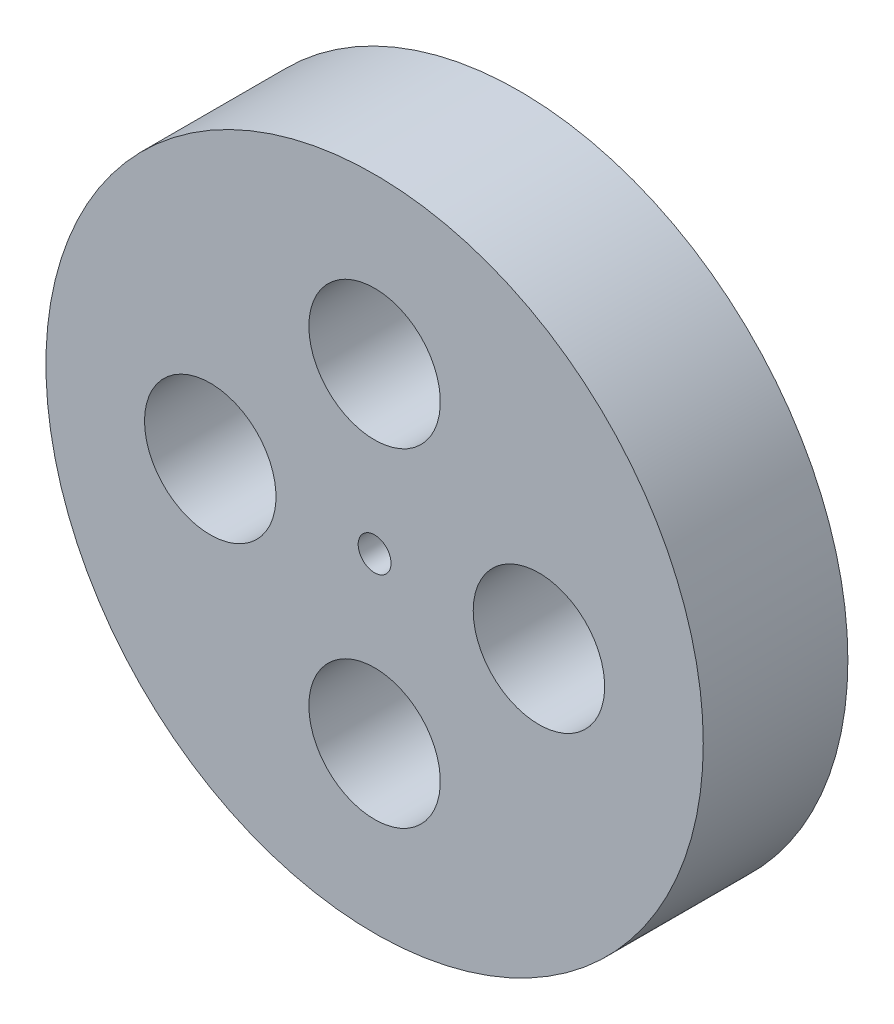
ISO-10303-21;
HEADER;
FILE_DESCRIPTION(('STEP AP214'),'2;1');
FILE_NAME('part.step','',(''),(''),'','','');
FILE_SCHEMA(('AUTOMOTIVE_DESIGN { 1 0 10303 214 1 1 1 1 }'));
ENDSEC;
DATA;
#1=APPLICATION_CONTEXT('core data for automotive mechanical design processes');
#2=APPLICATION_PROTOCOL_DEFINITION('international standard','automotive_design',2000,#1);
#3=PRODUCT_CONTEXT('',#1,'mechanical');
#4=PRODUCT('Part','Part','',(#3));
#5=PRODUCT_RELATED_PRODUCT_CATEGORY('part','',(#4));
#6=PRODUCT_DEFINITION_FORMATION('','',#4);
#7=PRODUCT_DEFINITION_CONTEXT('part definition',#1,'design');
#8=PRODUCT_DEFINITION('design','',#6,#7);
#9=PRODUCT_DEFINITION_SHAPE('','',#8);
#10=(LENGTH_UNIT() NAMED_UNIT(*) SI_UNIT(.MILLI.,.METRE.));
#11=(NAMED_UNIT(*) PLANE_ANGLE_UNIT() SI_UNIT($,.RADIAN.));
#12=(NAMED_UNIT(*) SI_UNIT($,.STERADIAN.) SOLID_ANGLE_UNIT());
#13=UNCERTAINTY_MEASURE_WITH_UNIT(LENGTH_MEASURE(1.E-05),#10,'distance_accuracy_value','');
#14=(GEOMETRIC_REPRESENTATION_CONTEXT(3) GLOBAL_UNCERTAINTY_ASSIGNED_CONTEXT((#13)) GLOBAL_UNIT_ASSIGNED_CONTEXT((#10,
#11,#12)) REPRESENTATION_CONTEXT('',''));
#15=CARTESIAN_POINT('',(0.,0.,0.));
#16=DIRECTION('',(0.,0.,1.));
#17=DIRECTION('',(1.,0.,0.));
#18=AXIS2_PLACEMENT_3D('',#15,#16,#17);
#19=CARTESIAN_POINT('',(0.,0.,15.));
#20=DIRECTION('',(0.,0.,1.));
#21=DIRECTION('',(1.,0.,0.));
#22=AXIS2_PLACEMENT_3D('',#19,#20,#21);
#23=PLANE('',#22);
#24=CARTESIAN_POINT('',(0.,0.,15.));
#25=DIRECTION('',(0.,0.,1.));
#26=DIRECTION('',(1.,0.,0.));
#27=AXIS2_PLACEMENT_3D('',#24,#25,#26);
#28=CIRCLE('',#27,2.5);
#29=CARTESIAN_POINT('',(2.36610408565091,-0.807187373455543,15.));
#30=VERTEX_POINT('',#29);
#31=CARTESIAN_POINT('',(2.24950569432884,1.09074475986921,15.));
#32=VERTEX_POINT('',#31);
#33=EDGE_CURVE('E86',#30,#32,#28,.T.);
#34=ORIENTED_EDGE('',*,*,#33,.T.);
#35=DIRECTION('',(0.0613188311201858,-0.998118229945759,0.));
#36=VECTOR('',#35,1.);
#37=CARTESIAN_POINT('',(2.30780488998987,0.141778693206834,15.));
#38=LINE('',#37,#36);
#39=EDGE_CURVE('E63',#32,#30,#38,.T.);
#40=ORIENTED_EDGE('',*,*,#39,.T.);
#41=EDGE_LOOP('',(#34,#40));
#42=FACE_BOUND('',#41,.T.);
#43=ADVANCED_FACE('F35',(#42),#23,.T.);
#44=CARTESIAN_POINT('',(0.,0.,22.));
#45=DIRECTION('',(0.,0.,-1.));
#46=DIRECTION('',(-1.,0.,0.));
#47=AXIS2_PLACEMENT_3D('',#44,#45,#46);
#48=CYLINDRICAL_SURFACE('',#47,50.);
#49=CARTESIAN_POINT('',(0.,0.,22.));
#50=DIRECTION('',(0.,0.,1.));
#51=DIRECTION('',(1.,0.,0.));
#52=AXIS2_PLACEMENT_3D('',#49,#50,#51);
#53=CIRCLE('',#52,50.);
#54=CARTESIAN_POINT('',(50.,0.,22.));
#55=VERTEX_POINT('',#54);
#56=EDGE_CURVE('E11',#55,#55,#53,.T.);
#57=ORIENTED_EDGE('',*,*,#56,.F.);
#58=EDGE_LOOP('',(#57));
#59=FACE_BOUND('',#58,.T.);
#60=CARTESIAN_POINT('',(0.,0.,0.));
#61=DIRECTION('',(0.,0.,1.));
#62=DIRECTION('',(1.,0.,0.));
#63=AXIS2_PLACEMENT_3D('',#60,#61,#62);
#64=CIRCLE('',#63,50.);
#65=CARTESIAN_POINT('',(50.,0.,0.));
#66=VERTEX_POINT('',#65);
#67=EDGE_CURVE('E39',#66,#66,#64,.T.);
#68=ORIENTED_EDGE('',*,*,#67,.T.);
#69=EDGE_LOOP('',(#68));
#70=FACE_BOUND('',#69,.T.);
#71=ADVANCED_FACE('F37',(#59,#70),#48,.T.);
#72=CARTESIAN_POINT('',(0.,0.,22.));
#73=DIRECTION('',(0.,0.,1.));
#74=DIRECTION('',(1.,0.,0.));
#75=AXIS2_PLACEMENT_3D('',#72,#73,#74);
#76=PLANE('',#75);
#77=CARTESIAN_POINT('',(25.,0.,22.));
#78=DIRECTION('',(0.,0.,-1.));
#79=DIRECTION('',(-1.,0.,0.));
#80=AXIS2_PLACEMENT_3D('',#77,#78,#79);
#81=CIRCLE('',#80,10.);
#82=CARTESIAN_POINT('',(15.,0.,22.));
#83=VERTEX_POINT('',#82);
#84=EDGE_CURVE('E138',#83,#83,#81,.T.);
#85=ORIENTED_EDGE('',*,*,#84,.T.);
#86=EDGE_LOOP('',(#85));
#87=FACE_BOUND('',#86,.T.);
#88=CARTESIAN_POINT('',(0.,-25.,22.));
#89=DIRECTION('',(0.,0.,-1.));
#90=DIRECTION('',(-1.,0.,0.));
#91=AXIS2_PLACEMENT_3D('',#88,#89,#90);
#92=CIRCLE('',#91,10.);
#93=CARTESIAN_POINT('',(-10.,-25.,22.));
#94=VERTEX_POINT('',#93);
#95=EDGE_CURVE('E145',#94,#94,#92,.T.);
#96=ORIENTED_EDGE('',*,*,#95,.T.);
#97=EDGE_LOOP('',(#96));
#98=FACE_BOUND('',#97,.T.);
#99=CARTESIAN_POINT('',(-25.,0.,22.));
#100=DIRECTION('',(0.,0.,-1.));
#101=DIRECTION('',(-1.,0.,0.));
#102=AXIS2_PLACEMENT_3D('',#99,#100,#101);
#103=CIRCLE('',#102,10.);
#104=CARTESIAN_POINT('',(-35.,0.,22.));
#105=VERTEX_POINT('',#104);
#106=EDGE_CURVE('E151',#105,#105,#103,.T.);
#107=ORIENTED_EDGE('',*,*,#106,.T.);
#108=EDGE_LOOP('',(#107));
#109=FACE_BOUND('',#108,.T.);
#110=CARTESIAN_POINT('',(0.,25.,22.));
#111=DIRECTION('',(0.,0.,-1.));
#112=DIRECTION('',(-1.,0.,0.));
#113=AXIS2_PLACEMENT_3D('',#110,#111,#112);
#114=CIRCLE('',#113,10.);
#115=CARTESIAN_POINT('',(-10.,25.,22.));
#116=VERTEX_POINT('',#115);
#117=EDGE_CURVE('E77',#116,#116,#114,.T.);
#118=ORIENTED_EDGE('',*,*,#117,.T.);
#119=EDGE_LOOP('',(#118));
#120=FACE_BOUND('',#119,.T.);
#121=CARTESIAN_POINT('',(0.,0.,22.));
#122=DIRECTION('',(0.,0.,1.));
#123=DIRECTION('',(1.,0.,0.));
#124=AXIS2_PLACEMENT_3D('',#121,#122,#123);
#125=CIRCLE('',#124,2.5);
#126=CARTESIAN_POINT('',(2.5,0.,22.));
#127=VERTEX_POINT('',#126);
#128=EDGE_CURVE('E67',#127,#127,#125,.T.);
#129=ORIENTED_EDGE('',*,*,#128,.F.);
#130=EDGE_LOOP('',(#129));
#131=FACE_BOUND('',#130,.T.);
#132=ORIENTED_EDGE('',*,*,#56,.T.);
#133=EDGE_LOOP('',(#132));
#134=FACE_BOUND('',#133,.T.);
#135=ADVANCED_FACE('F91',(#87,#98,#109,#120,#131,#134),#76,.T.);
#136=CARTESIAN_POINT('',(0.,0.,0.));
#137=DIRECTION('',(0.,0.,1.));
#138=DIRECTION('',(1.,0.,0.));
#139=AXIS2_PLACEMENT_3D('',#136,#137,#138);
#140=PLANE('',#139);
#141=CARTESIAN_POINT('',(25.,0.,0.));
#142=DIRECTION('',(0.,0.,-1.));
#143=DIRECTION('',(-1.,0.,0.));
#144=AXIS2_PLACEMENT_3D('',#141,#142,#143);
#145=CIRCLE('',#144,10.);
#146=CARTESIAN_POINT('',(15.,0.,0.));
#147=VERTEX_POINT('',#146);
#148=EDGE_CURVE('E140',#147,#147,#145,.T.);
#149=ORIENTED_EDGE('',*,*,#148,.F.);
#150=EDGE_LOOP('',(#149));
#151=FACE_BOUND('',#150,.T.);
#152=CARTESIAN_POINT('',(0.,-25.,0.));
#153=DIRECTION('',(0.,0.,-1.));
#154=DIRECTION('',(-1.,0.,0.));
#155=AXIS2_PLACEMENT_3D('',#152,#153,#154);
#156=CIRCLE('',#155,10.);
#157=CARTESIAN_POINT('',(-10.,-25.,0.));
#158=VERTEX_POINT('',#157);
#159=EDGE_CURVE('E142',#158,#158,#156,.T.);
#160=ORIENTED_EDGE('',*,*,#159,.F.);
#161=EDGE_LOOP('',(#160));
#162=FACE_BOUND('',#161,.T.);
#163=CARTESIAN_POINT('',(-25.,0.,0.));
#164=DIRECTION('',(0.,0.,-1.));
#165=DIRECTION('',(-1.,0.,0.));
#166=AXIS2_PLACEMENT_3D('',#163,#164,#165);
#167=CIRCLE('',#166,10.);
#168=CARTESIAN_POINT('',(-35.,0.,0.));
#169=VERTEX_POINT('',#168);
#170=EDGE_CURVE('E148',#169,#169,#167,.T.);
#171=ORIENTED_EDGE('',*,*,#170,.F.);
#172=EDGE_LOOP('',(#171));
#173=FACE_BOUND('',#172,.T.);
#174=CARTESIAN_POINT('',(0.,25.,0.));
#175=DIRECTION('',(0.,0.,-1.));
#176=DIRECTION('',(-1.,0.,0.));
#177=AXIS2_PLACEMENT_3D('',#174,#175,#176);
#178=CIRCLE('',#177,10.);
#179=CARTESIAN_POINT('',(-10.,25.,0.));
#180=VERTEX_POINT('',#179);
#181=EDGE_CURVE('E80',#180,#180,#178,.T.);
#182=ORIENTED_EDGE('',*,*,#181,.F.);
#183=EDGE_LOOP('',(#182));
#184=FACE_BOUND('',#183,.T.);
#185=CARTESIAN_POINT('',(0.,0.,0.));
#186=DIRECTION('',(0.,0.,-1.));
#187=DIRECTION('',(-1.,0.,0.));
#188=AXIS2_PLACEMENT_3D('',#185,#186,#187);
#189=CIRCLE('',#188,2.5);
#190=CARTESIAN_POINT('',(2.36610408565091,-0.807187373455542,0.));
#191=VERTEX_POINT('',#190);
#192=CARTESIAN_POINT('',(2.24950569432884,1.09074475986921,0.));
#193=VERTEX_POINT('',#192);
#194=EDGE_CURVE('E70',#191,#193,#189,.T.);
#195=ORIENTED_EDGE('',*,*,#194,.F.);
#196=DIRECTION('',(0.0613188311201858,-0.998118229945759,0.));
#197=VECTOR('',#196,1.);
#198=CARTESIAN_POINT('',(2.30780488998987,0.141778693206834,0.));
#199=LINE('',#198,#197);
#200=EDGE_CURVE('E55',#193,#191,#199,.T.);
#201=ORIENTED_EDGE('',*,*,#200,.F.);
#202=EDGE_LOOP('',(#195,#201));
#203=FACE_BOUND('',#202,.T.);
#204=ORIENTED_EDGE('',*,*,#67,.F.);
#205=EDGE_LOOP('',(#204));
#206=FACE_BOUND('',#205,.T.);
#207=ADVANCED_FACE('F75',(#151,#162,#173,#184,#203,#206),#140,.F.);
#208=CARTESIAN_POINT('',(0.,0.,15.));
#209=DIRECTION('',(0.,0.,1.));
#210=DIRECTION('',(1.,0.,0.));
#211=AXIS2_PLACEMENT_3D('',#208,#209,#210);
#212=CYLINDRICAL_SURFACE('',#211,2.5);
#213=ORIENTED_EDGE('',*,*,#33,.F.);
#214=DIRECTION('',(0.,0.,-1.));
#215=VECTOR('',#214,1.);
#216=CARTESIAN_POINT('',(2.36610408565091,-0.807187373455542,15.));
#217=LINE('',#216,#215);
#218=EDGE_CURVE('E50',#30,#191,#217,.T.);
#219=ORIENTED_EDGE('',*,*,#218,.T.);
#220=ORIENTED_EDGE('',*,*,#194,.T.);
#221=DIRECTION('',(0.,0.,-1.));
#222=VECTOR('',#221,1.);
#223=CARTESIAN_POINT('',(2.24950569432884,1.09074475986921,15.));
#224=LINE('',#223,#222);
#225=EDGE_CURVE('E60',#32,#193,#224,.T.);
#226=ORIENTED_EDGE('',*,*,#225,.F.);
#227=EDGE_LOOP('',(#213,#219,#220,#226));
#228=FACE_BOUND('',#227,.T.);
#229=ORIENTED_EDGE('',*,*,#128,.T.);
#230=EDGE_LOOP('',(#229));
#231=FACE_BOUND('',#230,.T.);
#232=ADVANCED_FACE('F71',(#228,#231),#212,.F.);
#233=CARTESIAN_POINT('',(2.30780488998987,0.141778693206834,15.));
#234=DIRECTION('',(0.998118229945759,0.0613188311201859,0.));
#235=DIRECTION('',(-0.0613188311201859,0.998118229945759,0.));
#236=AXIS2_PLACEMENT_3D('',#233,#234,#235);
#237=PLANE('',#236);
#238=ORIENTED_EDGE('',*,*,#200,.T.);
#239=ORIENTED_EDGE('',*,*,#218,.F.);
#240=ORIENTED_EDGE('',*,*,#39,.F.);
#241=ORIENTED_EDGE('',*,*,#225,.T.);
#242=EDGE_LOOP('',(#238,#239,#240,#241));
#243=FACE_BOUND('',#242,.T.);
#244=ADVANCED_FACE('F62',(#243),#237,.F.);
#245=CARTESIAN_POINT('',(0.,25.,22.));
#246=DIRECTION('',(0.,0.,-1.));
#247=DIRECTION('',(-1.,0.,0.));
#248=AXIS2_PLACEMENT_3D('',#245,#246,#247);
#249=CYLINDRICAL_SURFACE('',#248,10.);
#250=ORIENTED_EDGE('',*,*,#117,.F.);
#251=EDGE_LOOP('',(#250));
#252=FACE_BOUND('',#251,.T.);
#253=ORIENTED_EDGE('',*,*,#181,.T.);
#254=EDGE_LOOP('',(#253));
#255=FACE_BOUND('',#254,.T.);
#256=ADVANCED_FACE('F118',(#252,#255),#249,.F.);
#257=CARTESIAN_POINT('',(-25.,0.,22.));
#258=DIRECTION('',(0.,0.,-1.));
#259=DIRECTION('',(-1.,0.,0.));
#260=AXIS2_PLACEMENT_3D('',#257,#258,#259);
#261=CYLINDRICAL_SURFACE('',#260,10.);
#262=ORIENTED_EDGE('',*,*,#106,.F.);
#263=EDGE_LOOP('',(#262));
#264=FACE_BOUND('',#263,.T.);
#265=ORIENTED_EDGE('',*,*,#170,.T.);
#266=EDGE_LOOP('',(#265));
#267=FACE_BOUND('',#266,.T.);
#268=ADVANCED_FACE('F121',(#264,#267),#261,.F.);
#269=CARTESIAN_POINT('',(0.,-25.,22.));
#270=DIRECTION('',(0.,0.,-1.));
#271=DIRECTION('',(-1.,0.,0.));
#272=AXIS2_PLACEMENT_3D('',#269,#270,#271);
#273=CYLINDRICAL_SURFACE('',#272,10.);
#274=ORIENTED_EDGE('',*,*,#95,.F.);
#275=EDGE_LOOP('',(#274));
#276=FACE_BOUND('',#275,.T.);
#277=ORIENTED_EDGE('',*,*,#159,.T.);
#278=EDGE_LOOP('',(#277));
#279=FACE_BOUND('',#278,.T.);
#280=ADVANCED_FACE('F125',(#276,#279),#273,.F.);
#281=CARTESIAN_POINT('',(25.,0.,22.));
#282=DIRECTION('',(0.,0.,-1.));
#283=DIRECTION('',(-1.,0.,0.));
#284=AXIS2_PLACEMENT_3D('',#281,#282,#283);
#285=CYLINDRICAL_SURFACE('',#284,10.);
#286=ORIENTED_EDGE('',*,*,#84,.F.);
#287=EDGE_LOOP('',(#286));
#288=FACE_BOUND('',#287,.T.);
#289=ORIENTED_EDGE('',*,*,#148,.T.);
#290=EDGE_LOOP('',(#289));
#291=FACE_BOUND('',#290,.T.);
#292=ADVANCED_FACE('F129',(#288,#291),#285,.F.);
#293=CLOSED_SHELL('',(#43,#71,#135,#207,#232,#244,#256,#268,#280,#292));
#294=MANIFOLD_SOLID_BREP('B2',#293);
#295=ADVANCED_BREP_SHAPE_REPRESENTATION('',(#18,#294),#14);
#296=SHAPE_DEFINITION_REPRESENTATION(#9,#295);
ENDSEC;
END-ISO-10303-21;
